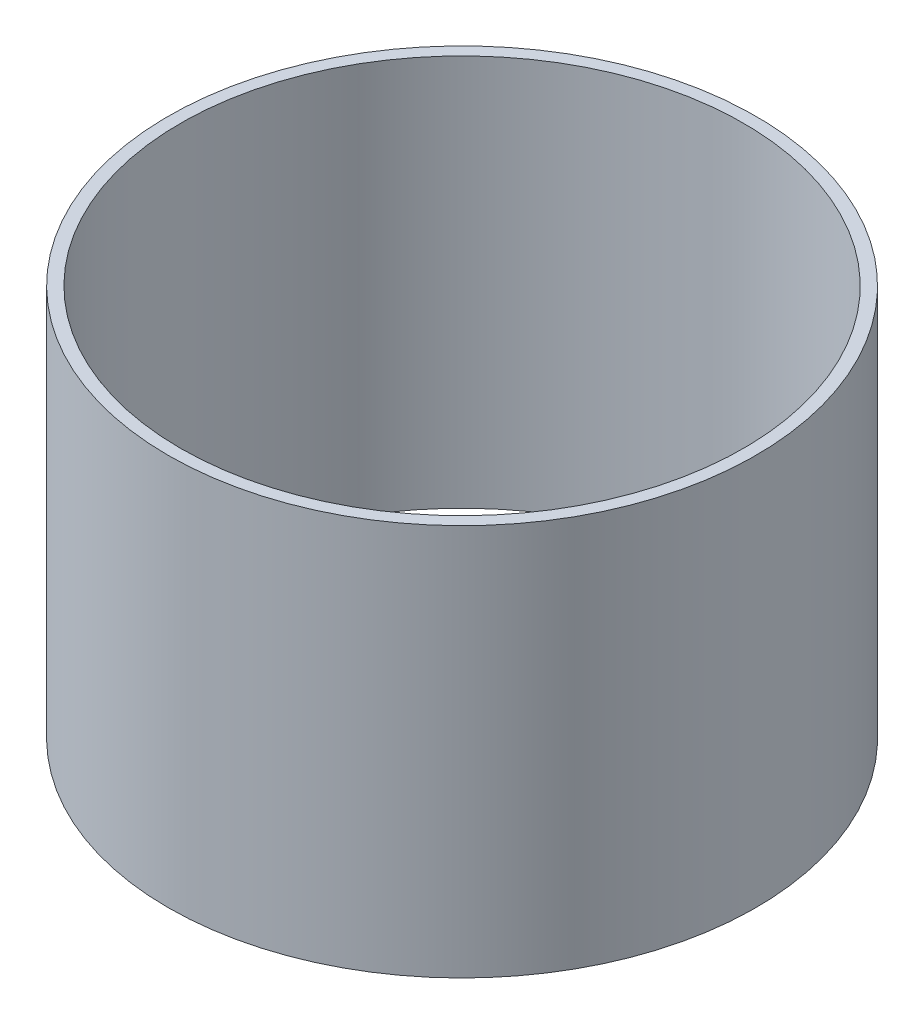
ISO-10303-21;
HEADER;
FILE_DESCRIPTION(('STEP AP214'),'2;1');
FILE_NAME('part.step','',(''),(''),'','','');
FILE_SCHEMA(('AUTOMOTIVE_DESIGN { 1 0 10303 214 1 1 1 1 }'));
ENDSEC;
DATA;
#1=APPLICATION_CONTEXT('core data for automotive mechanical design processes');
#2=APPLICATION_PROTOCOL_DEFINITION('international standard','automotive_design',2000,#1);
#3=PRODUCT_CONTEXT('',#1,'mechanical');
#4=PRODUCT('Part','Part','',(#3));
#5=PRODUCT_RELATED_PRODUCT_CATEGORY('part','',(#4));
#6=PRODUCT_DEFINITION_FORMATION('','',#4);
#7=PRODUCT_DEFINITION_CONTEXT('part definition',#1,'design');
#8=PRODUCT_DEFINITION('design','',#6,#7);
#9=PRODUCT_DEFINITION_SHAPE('','',#8);
#10=(LENGTH_UNIT() NAMED_UNIT(*) SI_UNIT(.MILLI.,.METRE.));
#11=(NAMED_UNIT(*) PLANE_ANGLE_UNIT() SI_UNIT($,.RADIAN.));
#12=(NAMED_UNIT(*) SI_UNIT($,.STERADIAN.) SOLID_ANGLE_UNIT());
#13=UNCERTAINTY_MEASURE_WITH_UNIT(LENGTH_MEASURE(1.E-05),#10,'distance_accuracy_value','');
#14=(GEOMETRIC_REPRESENTATION_CONTEXT(3) GLOBAL_UNCERTAINTY_ASSIGNED_CONTEXT((#13)) GLOBAL_UNIT_ASSIGNED_CONTEXT((#10,
#11,#12)) REPRESENTATION_CONTEXT('',''));
#15=CARTESIAN_POINT('',(0.,0.,0.));
#16=DIRECTION('',(0.,0.,1.));
#17=DIRECTION('',(1.,0.,0.));
#18=AXIS2_PLACEMENT_3D('',#15,#16,#17);
#19=CARTESIAN_POINT('',(0.,101.6,0.));
#20=DIRECTION('',(0.,1.,0.));
#21=DIRECTION('',(0.,0.,1.));
#22=AXIS2_PLACEMENT_3D('',#19,#20,#21);
#23=PLANE('',#22);
#24=CARTESIAN_POINT('',(0.,101.6,0.));
#25=DIRECTION('',(0.,1.,0.));
#26=DIRECTION('',(0.,0.,1.));
#27=AXIS2_PLACEMENT_3D('',#24,#25,#26);
#28=CIRCLE('',#27,76.2);
#29=CARTESIAN_POINT('',(0.,101.6,76.2));
#30=VERTEX_POINT('',#29);
#31=EDGE_CURVE('E10',#30,#30,#28,.T.);
#32=ORIENTED_EDGE('',*,*,#31,.T.);
#33=EDGE_LOOP('',(#32));
#34=FACE_BOUND('',#33,.T.);
#35=CARTESIAN_POINT('',(0.,101.6,0.));
#36=DIRECTION('',(0.,1.,0.));
#37=DIRECTION('',(0.,0.,1.));
#38=AXIS2_PLACEMENT_3D('',#35,#36,#37);
#39=CIRCLE('',#38,73.025);
#40=CARTESIAN_POINT('',(0.,101.6,73.025));
#41=VERTEX_POINT('',#40);
#42=EDGE_CURVE('E42',#41,#41,#39,.T.);
#43=ORIENTED_EDGE('',*,*,#42,.F.);
#44=EDGE_LOOP('',(#43));
#45=FACE_BOUND('',#44,.T.);
#46=ADVANCED_FACE('F31',(#34,#45),#23,.T.);
#47=CARTESIAN_POINT('',(0.,0.,0.));
#48=DIRECTION('',(0.,1.,0.));
#49=DIRECTION('',(0.,0.,1.));
#50=AXIS2_PLACEMENT_3D('',#47,#48,#49);
#51=PLANE('',#50);
#52=CARTESIAN_POINT('',(0.,0.,0.));
#53=DIRECTION('',(0.,1.,0.));
#54=DIRECTION('',(0.,0.,1.));
#55=AXIS2_PLACEMENT_3D('',#52,#53,#54);
#56=CIRCLE('',#55,76.2);
#57=CARTESIAN_POINT('',(0.,0.,76.2));
#58=VERTEX_POINT('',#57);
#59=EDGE_CURVE('E35',#58,#58,#56,.T.);
#60=ORIENTED_EDGE('',*,*,#59,.F.);
#61=EDGE_LOOP('',(#60));
#62=FACE_BOUND('',#61,.T.);
#63=CARTESIAN_POINT('',(0.,0.,0.));
#64=DIRECTION('',(0.,1.,0.));
#65=DIRECTION('',(0.,0.,1.));
#66=AXIS2_PLACEMENT_3D('',#63,#64,#65);
#67=CIRCLE('',#66,73.025);
#68=CARTESIAN_POINT('',(0.,0.,73.025));
#69=VERTEX_POINT('',#68);
#70=EDGE_CURVE('E44',#69,#69,#67,.T.);
#71=ORIENTED_EDGE('',*,*,#70,.T.);
#72=EDGE_LOOP('',(#71));
#73=FACE_BOUND('',#72,.T.);
#74=ADVANCED_FACE('F54',(#62,#73),#51,.F.);
#75=CARTESIAN_POINT('',(0.,101.6,0.));
#76=DIRECTION('',(0.,-1.,0.));
#77=DIRECTION('',(0.,0.,-1.));
#78=AXIS2_PLACEMENT_3D('',#75,#76,#77);
#79=CYLINDRICAL_SURFACE('',#78,76.2);
#80=ORIENTED_EDGE('',*,*,#31,.F.);
#81=EDGE_LOOP('',(#80));
#82=FACE_BOUND('',#81,.T.);
#83=ORIENTED_EDGE('',*,*,#59,.T.);
#84=EDGE_LOOP('',(#83));
#85=FACE_BOUND('',#84,.T.);
#86=ADVANCED_FACE('F33',(#82,#85),#79,.T.);
#87=CARTESIAN_POINT('',(0.,101.6,0.));
#88=DIRECTION('',(0.,-1.,0.));
#89=DIRECTION('',(0.,0.,-1.));
#90=AXIS2_PLACEMENT_3D('',#87,#88,#89);
#91=CYLINDRICAL_SURFACE('',#90,73.025);
#92=ORIENTED_EDGE('',*,*,#42,.T.);
#93=EDGE_LOOP('',(#92));
#94=FACE_BOUND('',#93,.T.);
#95=ORIENTED_EDGE('',*,*,#70,.F.);
#96=EDGE_LOOP('',(#95));
#97=FACE_BOUND('',#96,.T.);
#98=ADVANCED_FACE('F50',(#94,#97),#91,.F.);
#99=CLOSED_SHELL('',(#46,#74,#86,#98));
#100=MANIFOLD_SOLID_BREP('B2',#99);
#101=ADVANCED_BREP_SHAPE_REPRESENTATION('',(#18,#100),#14);
#102=SHAPE_DEFINITION_REPRESENTATION(#9,#101);
ENDSEC;
END-ISO-10303-21;
